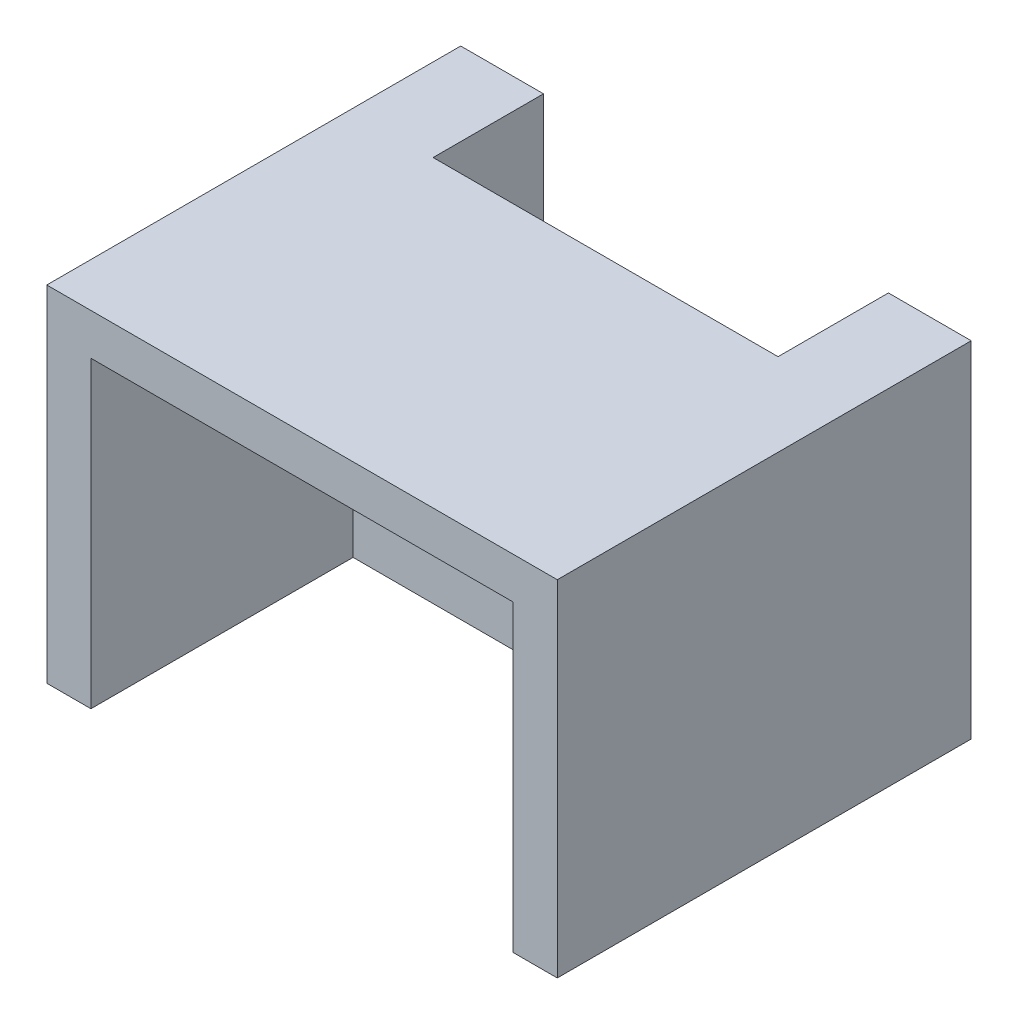
ISO-10303-21;
HEADER;
FILE_DESCRIPTION(('STEP AP214'),'2;1');
FILE_NAME('part.step','',(''),(''),'','','');
FILE_SCHEMA(('AUTOMOTIVE_DESIGN { 1 0 10303 214 1 1 1 1 }'));
ENDSEC;
DATA;
#1=APPLICATION_CONTEXT('core data for automotive mechanical design processes');
#2=APPLICATION_PROTOCOL_DEFINITION('international standard','automotive_design',2000,#1);
#3=PRODUCT_CONTEXT('',#1,'mechanical');
#4=PRODUCT('Part','Part','',(#3));
#5=PRODUCT_RELATED_PRODUCT_CATEGORY('part','',(#4));
#6=PRODUCT_DEFINITION_FORMATION('','',#4);
#7=PRODUCT_DEFINITION_CONTEXT('part definition',#1,'design');
#8=PRODUCT_DEFINITION('design','',#6,#7);
#9=PRODUCT_DEFINITION_SHAPE('','',#8);
#10=(LENGTH_UNIT() NAMED_UNIT(*) SI_UNIT(.MILLI.,.METRE.));
#11=(NAMED_UNIT(*) PLANE_ANGLE_UNIT() SI_UNIT($,.RADIAN.));
#12=(NAMED_UNIT(*) SI_UNIT($,.STERADIAN.) SOLID_ANGLE_UNIT());
#13=UNCERTAINTY_MEASURE_WITH_UNIT(LENGTH_MEASURE(1.E-05),#10,'distance_accuracy_value','');
#14=(GEOMETRIC_REPRESENTATION_CONTEXT(3) GLOBAL_UNCERTAINTY_ASSIGNED_CONTEXT((#13)) GLOBAL_UNIT_ASSIGNED_CONTEXT((#10,
#11,#12)) REPRESENTATION_CONTEXT('',''));
#15=CARTESIAN_POINT('',(0.,0.,0.));
#16=DIRECTION('',(0.,0.,1.));
#17=DIRECTION('',(1.,0.,0.));
#18=AXIS2_PLACEMENT_3D('',#15,#16,#17);
#19=CARTESIAN_POINT('',(0.,0.,-22.));
#20=DIRECTION('',(0.,0.,-1.));
#21=DIRECTION('',(0.,1.,0.));
#22=AXIS2_PLACEMENT_3D('',#19,#20,#21);
#23=PLANE('',#22);
#24=DIRECTION('',(0.,-1.,0.));
#25=VECTOR('',#24,1.);
#26=CARTESIAN_POINT('',(31.,0.,-22.));
#27=LINE('',#26,#25);
#28=CARTESIAN_POINT('',(31.,0.,-22.));
#29=VERTEX_POINT('',#28);
#30=CARTESIAN_POINT('',(31.,-15.,-22.));
#31=VERTEX_POINT('',#30);
#32=EDGE_CURVE('E222',#29,#31,#27,.T.);
#33=ORIENTED_EDGE('',*,*,#32,.T.);
#34=DIRECTION('',(1.,0.,0.));
#35=VECTOR('',#34,1.);
#36=CARTESIAN_POINT('',(30.2,-15.,-22.));
#37=LINE('',#36,#35);
#38=CARTESIAN_POINT('',(30.2,-15.,-22.));
#39=VERTEX_POINT('',#38);
#40=EDGE_CURVE('E215',#39,#31,#37,.T.);
#41=ORIENTED_EDGE('',*,*,#40,.F.);
#42=DIRECTION('',(0.,1.,0.));
#43=VECTOR('',#42,1.);
#44=CARTESIAN_POINT('',(30.2,-25.,-22.));
#45=LINE('',#44,#43);
#46=CARTESIAN_POINT('',(30.2,-25.,-22.));
#47=VERTEX_POINT('',#46);
#48=EDGE_CURVE('E202',#47,#39,#45,.T.);
#49=ORIENTED_EDGE('',*,*,#48,.F.);
#50=DIRECTION('',(-1.,0.,0.));
#51=VECTOR('',#50,1.);
#52=CARTESIAN_POINT('',(31.,-25.,-22.));
#53=LINE('',#52,#51);
#54=CARTESIAN_POINT('',(6.8,-25.,-22.));
#55=VERTEX_POINT('',#54);
#56=EDGE_CURVE('E213',#47,#55,#53,.T.);
#57=ORIENTED_EDGE('',*,*,#56,.T.);
#58=DIRECTION('',(0.,-1.,0.));
#59=VECTOR('',#58,1.);
#60=CARTESIAN_POINT('',(6.8,-15.,-22.));
#61=LINE('',#60,#59);
#62=CARTESIAN_POINT('',(6.8,-15.,-22.));
#63=VERTEX_POINT('',#62);
#64=EDGE_CURVE('E390',#63,#55,#61,.T.);
#65=ORIENTED_EDGE('',*,*,#64,.F.);
#66=DIRECTION('',(-1.,0.,0.));
#67=VECTOR('',#66,1.);
#68=CARTESIAN_POINT('',(6.8,-15.,-22.));
#69=LINE('',#68,#67);
#70=CARTESIAN_POINT('',(6.,-15.,-22.));
#71=VERTEX_POINT('',#70);
#72=EDGE_CURVE('E376',#63,#71,#69,.T.);
#73=ORIENTED_EDGE('',*,*,#72,.T.);
#74=DIRECTION('',(0.,1.,0.));
#75=VECTOR('',#74,1.);
#76=CARTESIAN_POINT('',(6.,0.,-22.));
#77=LINE('',#76,#75);
#78=CARTESIAN_POINT('',(6.,0.,-22.));
#79=VERTEX_POINT('',#78);
#80=EDGE_CURVE('E58',#71,#79,#77,.T.);
#81=ORIENTED_EDGE('',*,*,#80,.T.);
#82=DIRECTION('',(1.,0.,0.));
#83=VECTOR('',#82,1.);
#84=CARTESIAN_POINT('',(31.,0.,-22.));
#85=LINE('',#84,#83);
#86=EDGE_CURVE('E224',#79,#29,#85,.T.);
#87=ORIENTED_EDGE('',*,*,#86,.T.);
#88=EDGE_LOOP('',(#33,#41,#49,#57,#65,#73,#81,#87));
#89=FACE_BOUND('',#88,.T.);
#90=ADVANCED_FACE('F35',(#89),#23,.T.);
#91=CARTESIAN_POINT('',(31.,0.,-22.));
#92=DIRECTION('',(1.,0.,0.));
#93=DIRECTION('',(0.,1.,0.));
#94=AXIS2_PLACEMENT_3D('',#91,#92,#93);
#95=PLANE('',#94);
#96=DIRECTION('',(0.,0.,-1.));
#97=VECTOR('',#96,1.);
#98=CARTESIAN_POINT('',(31.,-15.,-22.));
#99=LINE('',#98,#97);
#100=CARTESIAN_POINT('',(31.,-15.,-26.5282800414558));
#101=VERTEX_POINT('',#100);
#102=EDGE_CURVE('E425',#31,#101,#99,.T.);
#103=ORIENTED_EDGE('',*,*,#102,.F.);
#104=ORIENTED_EDGE('',*,*,#32,.F.);
#105=DIRECTION('',(0.,0.,-1.));
#106=VECTOR('',#105,1.);
#107=CARTESIAN_POINT('',(31.,0.,-22.));
#108=LINE('',#107,#106);
#109=CARTESIAN_POINT('',(31.,0.,-30.));
#110=VERTEX_POINT('',#109);
#111=EDGE_CURVE('E232',#29,#110,#108,.T.);
#112=ORIENTED_EDGE('',*,*,#111,.T.);
#113=DIRECTION('',(0.,1.,0.));
#114=VECTOR('',#113,1.);
#115=CARTESIAN_POINT('',(31.,-25.,-30.));
#116=LINE('',#115,#114);
#117=CARTESIAN_POINT('',(31.,-15.,-30.));
#118=VERTEX_POINT('',#117);
#119=EDGE_CURVE('E347',#118,#110,#116,.T.);
#120=ORIENTED_EDGE('',*,*,#119,.F.);
#121=DIRECTION('',(0.,0.,-1.));
#122=VECTOR('',#121,1.);
#123=CARTESIAN_POINT('',(31.,-15.,-27.633974643175));
#124=LINE('',#123,#122);
#125=CARTESIAN_POINT('',(31.,-15.,-27.633974643175));
#126=VERTEX_POINT('',#125);
#127=EDGE_CURVE('E208',#126,#118,#124,.T.);
#128=ORIENTED_EDGE('',*,*,#127,.F.);
#129=DIRECTION('',(0.,0.994849751721338,0.101360601320199));
#130=VECTOR('',#129,1.);
#131=CARTESIAN_POINT('',(31.,-23.5,-28.5));
#132=LINE('',#131,#130);
#133=CARTESIAN_POINT('',(31.,-23.5,-28.5));
#134=VERTEX_POINT('',#133);
#135=EDGE_CURVE('E419',#134,#126,#132,.T.);
#136=ORIENTED_EDGE('',*,*,#135,.F.);
#137=DIRECTION('',(0.,0.,-1.));
#138=VECTOR('',#137,1.);
#139=CARTESIAN_POINT('',(31.,-23.5,-27.3943053982808));
#140=LINE('',#139,#138);
#141=CARTESIAN_POINT('',(31.,-23.5,-27.3943053982808));
#142=VERTEX_POINT('',#141);
#143=EDGE_CURVE('E421',#142,#134,#140,.T.);
#144=ORIENTED_EDGE('',*,*,#143,.F.);
#145=DIRECTION('',(0.,-0.994849751721338,-0.101360601320199));
#146=VECTOR('',#145,1.);
#147=CARTESIAN_POINT('',(31.,-15.,-26.5282800414558));
#148=LINE('',#147,#146);
#149=EDGE_CURVE('E423',#101,#142,#148,.T.);
#150=ORIENTED_EDGE('',*,*,#149,.F.);
#151=EDGE_LOOP('',(#103,#104,#112,#120,#128,#136,#144,#150));
#152=FACE_BOUND('',#151,.T.);
#153=ADVANCED_FACE('F300',(#152),#95,.F.);
#154=CARTESIAN_POINT('',(6.,0.,-22.));
#155=DIRECTION('',(-1.,0.,0.));
#156=DIRECTION('',(0.,-1.,0.));
#157=AXIS2_PLACEMENT_3D('',#154,#155,#156);
#158=PLANE('',#157);
#159=DIRECTION('',(0.,0.,1.));
#160=VECTOR('',#159,1.);
#161=CARTESIAN_POINT('',(6.,-15.,-30.));
#162=LINE('',#161,#160);
#163=CARTESIAN_POINT('',(6.,-15.,-30.));
#164=VERTEX_POINT('',#163);
#165=CARTESIAN_POINT('',(6.,-15.,-27.633974643175));
#166=VERTEX_POINT('',#165);
#167=EDGE_CURVE('E387',#164,#166,#162,.T.);
#168=ORIENTED_EDGE('',*,*,#167,.F.);
#169=DIRECTION('',(0.,-1.,0.));
#170=VECTOR('',#169,1.);
#171=CARTESIAN_POINT('',(6.,0.,-30.));
#172=LINE('',#171,#170);
#173=CARTESIAN_POINT('',(6.,0.,-30.));
#174=VERTEX_POINT('',#173);
#175=EDGE_CURVE('E352',#174,#164,#172,.T.);
#176=ORIENTED_EDGE('',*,*,#175,.F.);
#177=DIRECTION('',(0.,0.,-1.));
#178=VECTOR('',#177,1.);
#179=CARTESIAN_POINT('',(6.,0.,-22.));
#180=LINE('',#179,#178);
#181=EDGE_CURVE('E231',#79,#174,#180,.T.);
#182=ORIENTED_EDGE('',*,*,#181,.F.);
#183=ORIENTED_EDGE('',*,*,#80,.F.);
#184=DIRECTION('',(0.,0.,1.));
#185=VECTOR('',#184,1.);
#186=CARTESIAN_POINT('',(6.,-15.,-26.5282800414558));
#187=LINE('',#186,#185);
#188=CARTESIAN_POINT('',(6.,-15.,-26.5282800414558));
#189=VERTEX_POINT('',#188);
#190=EDGE_CURVE('E378',#189,#71,#187,.T.);
#191=ORIENTED_EDGE('',*,*,#190,.F.);
#192=DIRECTION('',(0.,0.994849751721338,0.101360601320199));
#193=VECTOR('',#192,1.);
#194=CARTESIAN_POINT('',(5.99999999999999,-23.5,-27.3943053982808));
#195=LINE('',#194,#193);
#196=CARTESIAN_POINT('',(5.99999999999999,-23.5,-27.3943053982808));
#197=VERTEX_POINT('',#196);
#198=EDGE_CURVE('E381',#197,#189,#195,.T.);
#199=ORIENTED_EDGE('',*,*,#198,.F.);
#200=DIRECTION('',(0.,0.,1.));
#201=VECTOR('',#200,1.);
#202=CARTESIAN_POINT('',(5.99999999999999,-23.5,-28.5));
#203=LINE('',#202,#201);
#204=CARTESIAN_POINT('',(5.99999999999999,-23.5,-28.5));
#205=VERTEX_POINT('',#204);
#206=EDGE_CURVE('E383',#205,#197,#203,.T.);
#207=ORIENTED_EDGE('',*,*,#206,.F.);
#208=DIRECTION('',(0.,-0.994849751721338,-0.101360601320199));
#209=VECTOR('',#208,1.);
#210=CARTESIAN_POINT('',(6.,-15.,-27.633974643175));
#211=LINE('',#210,#209);
#212=EDGE_CURVE('E385',#166,#205,#211,.T.);
#213=ORIENTED_EDGE('',*,*,#212,.F.);
#214=EDGE_LOOP('',(#168,#176,#182,#183,#191,#199,#207,#213));
#215=FACE_BOUND('',#214,.T.);
#216=ADVANCED_FACE('F294',(#215),#158,.F.);
#217=CARTESIAN_POINT('',(37.,-25.,0.));
#218=DIRECTION('',(0.,0.,-1.));
#219=DIRECTION('',(0.,1.,0.));
#220=AXIS2_PLACEMENT_3D('',#217,#218,#219);
#221=PLANE('',#220);
#222=DIRECTION('',(1.,0.,0.));
#223=VECTOR('',#222,1.);
#224=CARTESIAN_POINT('',(33.8,-3.,0.));
#225=LINE('',#224,#223);
#226=CARTESIAN_POINT('',(3.2,-3.,0.));
#227=VERTEX_POINT('',#226);
#228=CARTESIAN_POINT('',(33.8,-3.,0.));
#229=VERTEX_POINT('',#228);
#230=EDGE_CURVE('E242',#227,#229,#225,.T.);
#231=ORIENTED_EDGE('',*,*,#230,.T.);
#232=DIRECTION('',(0.,-1.,0.));
#233=VECTOR('',#232,1.);
#234=CARTESIAN_POINT('',(33.8,36.0188839360689,0.));
#235=LINE('',#234,#233);
#236=CARTESIAN_POINT('',(33.8,-25.,0.));
#237=VERTEX_POINT('',#236);
#238=EDGE_CURVE('E240',#229,#237,#235,.T.);
#239=ORIENTED_EDGE('',*,*,#238,.T.);
#240=DIRECTION('',(-1.,0.,0.));
#241=VECTOR('',#240,1.);
#242=CARTESIAN_POINT('',(37.,-25.,0.));
#243=LINE('',#242,#241);
#244=CARTESIAN_POINT('',(37.,-25.,0.));
#245=VERTEX_POINT('',#244);
#246=EDGE_CURVE('E12',#245,#237,#243,.T.);
#247=ORIENTED_EDGE('',*,*,#246,.F.);
#248=DIRECTION('',(0.,-1.,0.));
#249=VECTOR('',#248,1.);
#250=CARTESIAN_POINT('',(37.,-25.,0.));
#251=LINE('',#250,#249);
#252=CARTESIAN_POINT('',(37.,0.,0.));
#253=VERTEX_POINT('',#252);
#254=EDGE_CURVE('E263',#253,#245,#251,.T.);
#255=ORIENTED_EDGE('',*,*,#254,.F.);
#256=DIRECTION('',(-1.,0.,0.));
#257=VECTOR('',#256,1.);
#258=CARTESIAN_POINT('',(37.,0.,0.));
#259=LINE('',#258,#257);
#260=CARTESIAN_POINT('',(0.,0.,0.));
#261=VERTEX_POINT('',#260);
#262=EDGE_CURVE('E271',#253,#261,#259,.T.);
#263=ORIENTED_EDGE('',*,*,#262,.T.);
#264=DIRECTION('',(0.,-1.,0.));
#265=VECTOR('',#264,1.);
#266=CARTESIAN_POINT('',(0.,-25.,0.));
#267=LINE('',#266,#265);
#268=CARTESIAN_POINT('',(0.,-25.,0.));
#269=VERTEX_POINT('',#268);
#270=EDGE_CURVE('E262',#261,#269,#267,.T.);
#271=ORIENTED_EDGE('',*,*,#270,.T.);
#272=CARTESIAN_POINT('',(3.2,-25.,0.));
#273=VERTEX_POINT('',#272);
#274=EDGE_CURVE('E43',#273,#269,#243,.T.);
#275=ORIENTED_EDGE('',*,*,#274,.F.);
#276=DIRECTION('',(0.,-1.,0.));
#277=VECTOR('',#276,1.);
#278=CARTESIAN_POINT('',(3.2,36.0188839360689,0.));
#279=LINE('',#278,#277);
#280=EDGE_CURVE('E253',#227,#273,#279,.T.);
#281=ORIENTED_EDGE('',*,*,#280,.F.);
#282=EDGE_LOOP('',(#231,#239,#247,#255,#263,#271,#275,#281));
#283=FACE_BOUND('',#282,.T.);
#284=ADVANCED_FACE('F37',(#283),#221,.F.);
#285=CARTESIAN_POINT('',(37.,-25.,-25.));
#286=DIRECTION('',(0.,1.,0.));
#287=DIRECTION('',(0.,0.,1.));
#288=AXIS2_PLACEMENT_3D('',#285,#286,#287);
#289=PLANE('',#288);
#290=ORIENTED_EDGE('',*,*,#56,.F.);
#291=DIRECTION('',(0.,0.,1.));
#292=VECTOR('',#291,1.);
#293=CARTESIAN_POINT('',(30.2,-25.,-30.));
#294=LINE('',#293,#292);
#295=CARTESIAN_POINT('',(30.2,-25.,-30.));
#296=VERTEX_POINT('',#295);
#297=EDGE_CURVE('E199',#296,#47,#294,.T.);
#298=ORIENTED_EDGE('',*,*,#297,.F.);
#299=DIRECTION('',(-1.,0.,0.));
#300=VECTOR('',#299,1.);
#301=CARTESIAN_POINT('',(37.,-25.,-30.));
#302=LINE('',#301,#300);
#303=CARTESIAN_POINT('',(37.,-25.,-30.));
#304=VERTEX_POINT('',#303);
#305=EDGE_CURVE('E348',#304,#296,#302,.T.);
#306=ORIENTED_EDGE('',*,*,#305,.F.);
#307=DIRECTION('',(0.,0.,-1.));
#308=VECTOR('',#307,1.);
#309=CARTESIAN_POINT('',(37.,-25.,-25.));
#310=LINE('',#309,#308);
#311=EDGE_CURVE('E266',#245,#304,#310,.T.);
#312=ORIENTED_EDGE('',*,*,#311,.F.);
#313=ORIENTED_EDGE('',*,*,#246,.T.);
#314=DIRECTION('',(0.,0.,1.));
#315=VECTOR('',#314,1.);
#316=CARTESIAN_POINT('',(33.8,-25.,-19.));
#317=LINE('',#316,#315);
#318=CARTESIAN_POINT('',(33.8,-25.,-19.));
#319=VERTEX_POINT('',#318);
#320=EDGE_CURVE('E251',#319,#237,#317,.T.);
#321=ORIENTED_EDGE('',*,*,#320,.F.);
#322=DIRECTION('',(1.,0.,0.));
#323=VECTOR('',#322,1.);
#324=CARTESIAN_POINT('',(3.2,-25.,-19.));
#325=LINE('',#324,#323);
#326=CARTESIAN_POINT('',(3.2,-25.,-19.));
#327=VERTEX_POINT('',#326);
#328=EDGE_CURVE('E248',#327,#319,#325,.T.);
#329=ORIENTED_EDGE('',*,*,#328,.F.);
#330=DIRECTION('',(0.,0.,-1.));
#331=VECTOR('',#330,1.);
#332=CARTESIAN_POINT('',(3.2,-25.,0.));
#333=LINE('',#332,#331);
#334=EDGE_CURVE('E235',#273,#327,#333,.T.);
#335=ORIENTED_EDGE('',*,*,#334,.F.);
#336=ORIENTED_EDGE('',*,*,#274,.T.);
#337=DIRECTION('',(0.,0.,-1.));
#338=VECTOR('',#337,1.);
#339=CARTESIAN_POINT('',(0.,-25.,-25.));
#340=LINE('',#339,#338);
#341=CARTESIAN_POINT('',(0.,-25.,-30.));
#342=VERTEX_POINT('',#341);
#343=EDGE_CURVE('E274',#269,#342,#340,.T.);
#344=ORIENTED_EDGE('',*,*,#343,.T.);
#345=DIRECTION('',(-1.,0.,0.));
#346=VECTOR('',#345,1.);
#347=CARTESIAN_POINT('',(5.99999999999999,-25.,-30.));
#348=LINE('',#347,#346);
#349=CARTESIAN_POINT('',(6.8,-25.,-30.));
#350=VERTEX_POINT('',#349);
#351=EDGE_CURVE('E349',#350,#342,#348,.T.);
#352=ORIENTED_EDGE('',*,*,#351,.F.);
#353=DIRECTION('',(0.,0.,-1.));
#354=VECTOR('',#353,1.);
#355=CARTESIAN_POINT('',(6.8,-25.,-22.));
#356=LINE('',#355,#354);
#357=EDGE_CURVE('E221',#55,#350,#356,.T.);
#358=ORIENTED_EDGE('',*,*,#357,.F.);
#359=EDGE_LOOP('',(#290,#298,#306,#312,#313,#321,#329,#335,#336,#344,#352,#358));
#360=FACE_BOUND('',#359,.T.);
#361=ADVANCED_FACE('F219',(#360),#289,.F.);
#362=CARTESIAN_POINT('',(37.,0.,0.));
#363=DIRECTION('',(0.,-1.,0.));
#364=DIRECTION('',(0.,0.,-1.));
#365=AXIS2_PLACEMENT_3D('',#362,#363,#364);
#366=PLANE('',#365);
#367=DIRECTION('',(0.,0.,1.));
#368=VECTOR('',#367,1.);
#369=CARTESIAN_POINT('',(37.,0.,0.));
#370=LINE('',#369,#368);
#371=CARTESIAN_POINT('',(37.,0.,-30.));
#372=VERTEX_POINT('',#371);
#373=EDGE_CURVE('E269',#372,#253,#370,.T.);
#374=ORIENTED_EDGE('',*,*,#373,.F.);
#375=DIRECTION('',(1.,0.,0.));
#376=VECTOR('',#375,1.);
#377=CARTESIAN_POINT('',(31.,0.,-30.));
#378=LINE('',#377,#376);
#379=EDGE_CURVE('E226',#110,#372,#378,.T.);
#380=ORIENTED_EDGE('',*,*,#379,.F.);
#381=ORIENTED_EDGE('',*,*,#111,.F.);
#382=ORIENTED_EDGE('',*,*,#86,.F.);
#383=ORIENTED_EDGE('',*,*,#181,.T.);
#384=DIRECTION('',(1.,0.,0.));
#385=VECTOR('',#384,1.);
#386=CARTESIAN_POINT('',(0.,0.,-30.));
#387=LINE('',#386,#385);
#388=CARTESIAN_POINT('',(0.,0.,-30.));
#389=VERTEX_POINT('',#388);
#390=EDGE_CURVE('E358',#389,#174,#387,.T.);
#391=ORIENTED_EDGE('',*,*,#390,.F.);
#392=DIRECTION('',(0.,0.,1.));
#393=VECTOR('',#392,1.);
#394=CARTESIAN_POINT('',(0.,0.,0.));
#395=LINE('',#394,#393);
#396=EDGE_CURVE('E267',#389,#261,#395,.T.);
#397=ORIENTED_EDGE('',*,*,#396,.T.);
#398=ORIENTED_EDGE('',*,*,#262,.F.);
#399=EDGE_LOOP('',(#374,#380,#381,#382,#383,#391,#397,#398));
#400=FACE_BOUND('',#399,.T.);
#401=ADVANCED_FACE('F299',(#400),#366,.F.);
#402=CARTESIAN_POINT('',(37.,0.,0.));
#403=DIRECTION('',(-1.,0.,0.));
#404=DIRECTION('',(0.,0.,1.));
#405=AXIS2_PLACEMENT_3D('',#402,#403,#404);
#406=PLANE('',#405);
#407=ORIENTED_EDGE('',*,*,#254,.T.);
#408=ORIENTED_EDGE('',*,*,#311,.T.);
#409=DIRECTION('',(0.,-1.,0.));
#410=VECTOR('',#409,1.);
#411=CARTESIAN_POINT('',(37.,0.,-30.));
#412=LINE('',#411,#410);
#413=EDGE_CURVE('E345',#372,#304,#412,.T.);
#414=ORIENTED_EDGE('',*,*,#413,.F.);
#415=ORIENTED_EDGE('',*,*,#373,.T.);
#416=EDGE_LOOP('',(#407,#408,#414,#415));
#417=FACE_BOUND('',#416,.T.);
#418=ADVANCED_FACE('F330',(#417),#406,.F.);
#419=CARTESIAN_POINT('',(0.,0.,0.));
#420=DIRECTION('',(-1.,0.,0.));
#421=DIRECTION('',(0.,0.,1.));
#422=AXIS2_PLACEMENT_3D('',#419,#420,#421);
#423=PLANE('',#422);
#424=ORIENTED_EDGE('',*,*,#270,.F.);
#425=ORIENTED_EDGE('',*,*,#396,.F.);
#426=DIRECTION('',(0.,1.,0.));
#427=VECTOR('',#426,1.);
#428=CARTESIAN_POINT('',(0.,-25.,-30.));
#429=LINE('',#428,#427);
#430=EDGE_CURVE('E291',#342,#389,#429,.T.);
#431=ORIENTED_EDGE('',*,*,#430,.F.);
#432=ORIENTED_EDGE('',*,*,#343,.F.);
#433=EDGE_LOOP('',(#424,#425,#431,#432));
#434=FACE_BOUND('',#433,.T.);
#435=ADVANCED_FACE('F289',(#434),#423,.T.);
#436=CARTESIAN_POINT('',(33.8,36.0188839360689,-19.));
#437=DIRECTION('',(1.,0.,0.));
#438=DIRECTION('',(0.,0.,-1.));
#439=AXIS2_PLACEMENT_3D('',#436,#437,#438);
#440=PLANE('',#439);
#441=DIRECTION('',(0.,0.,-1.));
#442=VECTOR('',#441,1.);
#443=CARTESIAN_POINT('',(33.8,-3.,-19.));
#444=LINE('',#443,#442);
#445=CARTESIAN_POINT('',(33.8,-3.,-19.));
#446=VERTEX_POINT('',#445);
#447=EDGE_CURVE('E239',#229,#446,#444,.T.);
#448=ORIENTED_EDGE('',*,*,#447,.T.);
#449=DIRECTION('',(0.,-1.,0.));
#450=VECTOR('',#449,1.);
#451=CARTESIAN_POINT('',(33.8,36.0188839360689,-19.));
#452=LINE('',#451,#450);
#453=EDGE_CURVE('E256',#446,#319,#452,.T.);
#454=ORIENTED_EDGE('',*,*,#453,.T.);
#455=ORIENTED_EDGE('',*,*,#320,.T.);
#456=ORIENTED_EDGE('',*,*,#238,.F.);
#457=EDGE_LOOP('',(#448,#454,#455,#456));
#458=FACE_BOUND('',#457,.T.);
#459=ADVANCED_FACE('F319',(#458),#440,.F.);
#460=CARTESIAN_POINT('',(3.2,36.0188839360689,-19.));
#461=DIRECTION('',(0.,0.,-1.));
#462=DIRECTION('',(0.,1.,0.));
#463=AXIS2_PLACEMENT_3D('',#460,#461,#462);
#464=PLANE('',#463);
#465=DIRECTION('',(-1.,0.,0.));
#466=VECTOR('',#465,1.);
#467=CARTESIAN_POINT('',(3.2,-3.,-19.));
#468=LINE('',#467,#466);
#469=CARTESIAN_POINT('',(3.2,-2.99999999999999,-19.));
#470=VERTEX_POINT('',#469);
#471=EDGE_CURVE('E237',#446,#470,#468,.T.);
#472=ORIENTED_EDGE('',*,*,#471,.T.);
#473=DIRECTION('',(0.,-1.,0.));
#474=VECTOR('',#473,1.);
#475=CARTESIAN_POINT('',(3.2,36.0188839360689,-19.));
#476=LINE('',#475,#474);
#477=EDGE_CURVE('E258',#470,#327,#476,.T.);
#478=ORIENTED_EDGE('',*,*,#477,.T.);
#479=ORIENTED_EDGE('',*,*,#328,.T.);
#480=ORIENTED_EDGE('',*,*,#453,.F.);
#481=EDGE_LOOP('',(#472,#478,#479,#480));
#482=FACE_BOUND('',#481,.T.);
#483=ADVANCED_FACE('F322',(#482),#464,.F.);
#484=CARTESIAN_POINT('',(3.2,36.0188839360689,0.));
#485=DIRECTION('',(-1.,0.,0.));
#486=DIRECTION('',(0.,0.,1.));
#487=AXIS2_PLACEMENT_3D('',#484,#485,#486);
#488=PLANE('',#487);
#489=DIRECTION('',(0.,0.,1.));
#490=VECTOR('',#489,1.);
#491=CARTESIAN_POINT('',(3.2,-3.,0.));
#492=LINE('',#491,#490);
#493=EDGE_CURVE('E245',#470,#227,#492,.T.);
#494=ORIENTED_EDGE('',*,*,#493,.T.);
#495=ORIENTED_EDGE('',*,*,#280,.T.);
#496=ORIENTED_EDGE('',*,*,#334,.T.);
#497=ORIENTED_EDGE('',*,*,#477,.F.);
#498=EDGE_LOOP('',(#494,#495,#496,#497));
#499=FACE_BOUND('',#498,.T.);
#500=ADVANCED_FACE('F317',(#499),#488,.F.);
#501=CARTESIAN_POINT('',(37.,-3.,0.));
#502=DIRECTION('',(0.,-1.,0.));
#503=DIRECTION('',(0.,0.,-1.));
#504=AXIS2_PLACEMENT_3D('',#501,#502,#503);
#505=PLANE('',#504);
#506=ORIENTED_EDGE('',*,*,#230,.F.);
#507=ORIENTED_EDGE('',*,*,#493,.F.);
#508=ORIENTED_EDGE('',*,*,#471,.F.);
#509=ORIENTED_EDGE('',*,*,#447,.F.);
#510=EDGE_LOOP('',(#506,#507,#508,#509));
#511=FACE_BOUND('',#510,.T.);
#512=ADVANCED_FACE('F314',(#511),#505,.T.);
#513=CARTESIAN_POINT('',(0.,0.,-30.));
#514=DIRECTION('',(0.,0.,-1.));
#515=DIRECTION('',(0.,1.,0.));
#516=AXIS2_PLACEMENT_3D('',#513,#514,#515);
#517=PLANE('',#516);
#518=ORIENTED_EDGE('',*,*,#413,.T.);
#519=ORIENTED_EDGE('',*,*,#305,.T.);
#520=DIRECTION('',(0.,-1.,0.));
#521=VECTOR('',#520,1.);
#522=CARTESIAN_POINT('',(30.2,-15.,-30.));
#523=LINE('',#522,#521);
#524=CARTESIAN_POINT('',(30.2,-15.,-30.));
#525=VERTEX_POINT('',#524);
#526=EDGE_CURVE('E204',#525,#296,#523,.T.);
#527=ORIENTED_EDGE('',*,*,#526,.F.);
#528=DIRECTION('',(1.,0.,0.));
#529=VECTOR('',#528,1.);
#530=CARTESIAN_POINT('',(30.2,-15.,-30.));
#531=LINE('',#530,#529);
#532=EDGE_CURVE('E50',#525,#118,#531,.T.);
#533=ORIENTED_EDGE('',*,*,#532,.T.);
#534=ORIENTED_EDGE('',*,*,#119,.T.);
#535=ORIENTED_EDGE('',*,*,#379,.T.);
#536=EDGE_LOOP('',(#518,#519,#527,#533,#534,#535));
#537=FACE_BOUND('',#536,.T.);
#538=ADVANCED_FACE('F311',(#537),#517,.T.);
#539=CARTESIAN_POINT('',(0.,0.,-30.));
#540=DIRECTION('',(0.,0.,-1.));
#541=DIRECTION('',(0.,1.,0.));
#542=AXIS2_PLACEMENT_3D('',#539,#540,#541);
#543=PLANE('',#542);
#544=ORIENTED_EDGE('',*,*,#430,.T.);
#545=ORIENTED_EDGE('',*,*,#390,.T.);
#546=ORIENTED_EDGE('',*,*,#175,.T.);
#547=DIRECTION('',(-1.,0.,0.));
#548=VECTOR('',#547,1.);
#549=CARTESIAN_POINT('',(6.8,-15.,-30.));
#550=LINE('',#549,#548);
#551=CARTESIAN_POINT('',(6.8,-15.,-30.));
#552=VERTEX_POINT('',#551);
#553=EDGE_CURVE('E362',#552,#164,#550,.T.);
#554=ORIENTED_EDGE('',*,*,#553,.F.);
#555=DIRECTION('',(0.,1.,0.));
#556=VECTOR('',#555,1.);
#557=CARTESIAN_POINT('',(6.8,-25.,-30.));
#558=LINE('',#557,#556);
#559=EDGE_CURVE('E380',#350,#552,#558,.T.);
#560=ORIENTED_EDGE('',*,*,#559,.F.);
#561=ORIENTED_EDGE('',*,*,#351,.T.);
#562=EDGE_LOOP('',(#544,#545,#546,#554,#560,#561));
#563=FACE_BOUND('',#562,.T.);
#564=ADVANCED_FACE('F470',(#563),#543,.T.);
#565=CARTESIAN_POINT('',(6.8,-15.,-30.));
#566=DIRECTION('',(0.,-1.,0.));
#567=DIRECTION('',(1.,0.,0.));
#568=AXIS2_PLACEMENT_3D('',#565,#566,#567);
#569=PLANE('',#568);
#570=ORIENTED_EDGE('',*,*,#167,.T.);
#571=DIRECTION('',(-1.,0.,0.));
#572=VECTOR('',#571,1.);
#573=CARTESIAN_POINT('',(6.8,-15.,-27.633974643175));
#574=LINE('',#573,#572);
#575=CARTESIAN_POINT('',(6.8,-15.,-27.633974643175));
#576=VERTEX_POINT('',#575);
#577=EDGE_CURVE('E364',#576,#166,#574,.T.);
#578=ORIENTED_EDGE('',*,*,#577,.F.);
#579=DIRECTION('',(0.,0.,1.));
#580=VECTOR('',#579,1.);
#581=CARTESIAN_POINT('',(6.8,-15.,-30.));
#582=LINE('',#581,#580);
#583=EDGE_CURVE('E400',#552,#576,#582,.T.);
#584=ORIENTED_EDGE('',*,*,#583,.F.);
#585=ORIENTED_EDGE('',*,*,#553,.T.);
#586=EDGE_LOOP('',(#570,#578,#584,#585));
#587=FACE_BOUND('',#586,.T.);
#588=ADVANCED_FACE('F477',(#587),#569,.F.);
#589=CARTESIAN_POINT('',(6.8,-15.,-27.633974643175));
#590=DIRECTION('',(0.,0.101360601320199,-0.994849751721338));
#591=DIRECTION('',(0.,0.994849751721338,0.101360601320199));
#592=AXIS2_PLACEMENT_3D('',#589,#590,#591);
#593=PLANE('',#592);
#594=ORIENTED_EDGE('',*,*,#212,.T.);
#595=DIRECTION('',(-1.,0.,0.));
#596=VECTOR('',#595,1.);
#597=CARTESIAN_POINT('',(6.8,-23.5,-28.5));
#598=LINE('',#597,#596);
#599=CARTESIAN_POINT('',(6.8,-23.5,-28.5));
#600=VERTEX_POINT('',#599);
#601=EDGE_CURVE('E367',#600,#205,#598,.T.);
#602=ORIENTED_EDGE('',*,*,#601,.F.);
#603=DIRECTION('',(0.,-0.994849751721338,-0.101360601320199));
#604=VECTOR('',#603,1.);
#605=CARTESIAN_POINT('',(6.8,-15.,-27.633974643175));
#606=LINE('',#605,#604);
#607=EDGE_CURVE('E398',#576,#600,#606,.T.);
#608=ORIENTED_EDGE('',*,*,#607,.F.);
#609=ORIENTED_EDGE('',*,*,#577,.T.);
#610=EDGE_LOOP('',(#594,#602,#608,#609));
#611=FACE_BOUND('',#610,.T.);
#612=ADVANCED_FACE('F480',(#611),#593,.F.);
#613=CARTESIAN_POINT('',(6.8,-23.5,-28.5));
#614=DIRECTION('',(0.,-1.,0.));
#615=DIRECTION('',(0.,0.,-1.));
#616=AXIS2_PLACEMENT_3D('',#613,#614,#615);
#617=PLANE('',#616);
#618=ORIENTED_EDGE('',*,*,#206,.T.);
#619=DIRECTION('',(-1.,0.,0.));
#620=VECTOR('',#619,1.);
#621=CARTESIAN_POINT('',(6.8,-23.5,-27.3943053982808));
#622=LINE('',#621,#620);
#623=CARTESIAN_POINT('',(6.8,-23.5,-27.3943053982808));
#624=VERTEX_POINT('',#623);
#625=EDGE_CURVE('E370',#624,#197,#622,.T.);
#626=ORIENTED_EDGE('',*,*,#625,.F.);
#627=DIRECTION('',(0.,0.,1.));
#628=VECTOR('',#627,1.);
#629=CARTESIAN_POINT('',(6.8,-23.5,-28.5));
#630=LINE('',#629,#628);
#631=EDGE_CURVE('E396',#600,#624,#630,.T.);
#632=ORIENTED_EDGE('',*,*,#631,.F.);
#633=ORIENTED_EDGE('',*,*,#601,.T.);
#634=EDGE_LOOP('',(#618,#626,#632,#633));
#635=FACE_BOUND('',#634,.T.);
#636=ADVANCED_FACE('F498',(#635),#617,.F.);
#637=CARTESIAN_POINT('',(6.8,-23.5,-27.3943053982808));
#638=DIRECTION('',(0.,-0.101360601320199,0.994849751721338));
#639=DIRECTION('',(0.,-0.994849751721338,-0.101360601320199));
#640=AXIS2_PLACEMENT_3D('',#637,#638,#639);
#641=PLANE('',#640);
#642=ORIENTED_EDGE('',*,*,#198,.T.);
#643=DIRECTION('',(-1.,0.,0.));
#644=VECTOR('',#643,1.);
#645=CARTESIAN_POINT('',(6.8,-15.,-26.5282800414558));
#646=LINE('',#645,#644);
#647=CARTESIAN_POINT('',(6.8,-15.,-26.5282800414558));
#648=VERTEX_POINT('',#647);
#649=EDGE_CURVE('E373',#648,#189,#646,.T.);
#650=ORIENTED_EDGE('',*,*,#649,.F.);
#651=DIRECTION('',(0.,0.994849751721338,0.101360601320199));
#652=VECTOR('',#651,1.);
#653=CARTESIAN_POINT('',(6.8,-23.5,-27.3943053982808));
#654=LINE('',#653,#652);
#655=EDGE_CURVE('E394',#624,#648,#654,.T.);
#656=ORIENTED_EDGE('',*,*,#655,.F.);
#657=ORIENTED_EDGE('',*,*,#625,.T.);
#658=EDGE_LOOP('',(#642,#650,#656,#657));
#659=FACE_BOUND('',#658,.T.);
#660=ADVANCED_FACE('F496',(#659),#641,.F.);
#661=CARTESIAN_POINT('',(6.8,-15.,-26.5282800414558));
#662=DIRECTION('',(0.,-1.,0.));
#663=DIRECTION('',(1.,0.,0.));
#664=AXIS2_PLACEMENT_3D('',#661,#662,#663);
#665=PLANE('',#664);
#666=ORIENTED_EDGE('',*,*,#190,.T.);
#667=ORIENTED_EDGE('',*,*,#72,.F.);
#668=DIRECTION('',(0.,0.,1.));
#669=VECTOR('',#668,1.);
#670=CARTESIAN_POINT('',(6.8,-15.,-26.5282800414558));
#671=LINE('',#670,#669);
#672=EDGE_CURVE('E392',#648,#63,#671,.T.);
#673=ORIENTED_EDGE('',*,*,#672,.F.);
#674=ORIENTED_EDGE('',*,*,#649,.T.);
#675=EDGE_LOOP('',(#666,#667,#673,#674));
#676=FACE_BOUND('',#675,.T.);
#677=ADVANCED_FACE('F492',(#676),#665,.F.);
#678=CARTESIAN_POINT('',(6.8,0.,0.));
#679=DIRECTION('',(1.,0.,0.));
#680=DIRECTION('',(0.,1.,0.));
#681=AXIS2_PLACEMENT_3D('',#678,#679,#680);
#682=PLANE('',#681);
#683=ORIENTED_EDGE('',*,*,#559,.T.);
#684=ORIENTED_EDGE('',*,*,#583,.T.);
#685=ORIENTED_EDGE('',*,*,#607,.T.);
#686=ORIENTED_EDGE('',*,*,#631,.T.);
#687=ORIENTED_EDGE('',*,*,#655,.T.);
#688=ORIENTED_EDGE('',*,*,#672,.T.);
#689=ORIENTED_EDGE('',*,*,#64,.T.);
#690=ORIENTED_EDGE('',*,*,#357,.T.);
#691=EDGE_LOOP('',(#683,#684,#685,#686,#687,#688,#689,#690));
#692=FACE_BOUND('',#691,.T.);
#693=ADVANCED_FACE('F484',(#692),#682,.T.);
#694=CARTESIAN_POINT('',(30.2,-15.,-22.));
#695=DIRECTION('',(0.,-1.,0.));
#696=DIRECTION('',(1.,0.,0.));
#697=AXIS2_PLACEMENT_3D('',#694,#695,#696);
#698=PLANE('',#697);
#699=ORIENTED_EDGE('',*,*,#102,.T.);
#700=DIRECTION('',(1.,0.,0.));
#701=VECTOR('',#700,1.);
#702=CARTESIAN_POINT('',(30.2,-15.,-26.5282800414558));
#703=LINE('',#702,#701);
#704=CARTESIAN_POINT('',(30.2,-15.,-26.5282800414558));
#705=VERTEX_POINT('',#704);
#706=EDGE_CURVE('E405',#705,#101,#703,.T.);
#707=ORIENTED_EDGE('',*,*,#706,.F.);
#708=DIRECTION('',(0.,0.,-1.));
#709=VECTOR('',#708,1.);
#710=CARTESIAN_POINT('',(30.2,-15.,-22.));
#711=LINE('',#710,#709);
#712=EDGE_CURVE('E216',#39,#705,#711,.T.);
#713=ORIENTED_EDGE('',*,*,#712,.F.);
#714=ORIENTED_EDGE('',*,*,#40,.T.);
#715=EDGE_LOOP('',(#699,#707,#713,#714));
#716=FACE_BOUND('',#715,.T.);
#717=ADVANCED_FACE('F440',(#716),#698,.F.);
#718=CARTESIAN_POINT('',(30.2,-15.,-26.5282800414558));
#719=DIRECTION('',(0.,-0.101360601320199,0.994849751721338));
#720=DIRECTION('',(0.,-0.994849751721338,-0.101360601320199));
#721=AXIS2_PLACEMENT_3D('',#718,#719,#720);
#722=PLANE('',#721);
#723=ORIENTED_EDGE('',*,*,#149,.T.);
#724=DIRECTION('',(1.,0.,0.));
#725=VECTOR('',#724,1.);
#726=CARTESIAN_POINT('',(30.2,-23.5,-27.3943053982808));
#727=LINE('',#726,#725);
#728=CARTESIAN_POINT('',(30.2,-23.5,-27.3943053982808));
#729=VERTEX_POINT('',#728);
#730=EDGE_CURVE('E408',#729,#142,#727,.T.);
#731=ORIENTED_EDGE('',*,*,#730,.F.);
#732=DIRECTION('',(0.,-0.994849751721338,-0.101360601320199));
#733=VECTOR('',#732,1.);
#734=CARTESIAN_POINT('',(30.2,-15.,-26.5282800414558));
#735=LINE('',#734,#733);
#736=EDGE_CURVE('E434',#705,#729,#735,.T.);
#737=ORIENTED_EDGE('',*,*,#736,.F.);
#738=ORIENTED_EDGE('',*,*,#706,.T.);
#739=EDGE_LOOP('',(#723,#731,#737,#738));
#740=FACE_BOUND('',#739,.T.);
#741=ADVANCED_FACE('F444',(#740),#722,.F.);
#742=CARTESIAN_POINT('',(30.2,-23.5,-27.3943053982808));
#743=DIRECTION('',(0.,-1.,0.));
#744=DIRECTION('',(0.,0.,-1.));
#745=AXIS2_PLACEMENT_3D('',#742,#743,#744);
#746=PLANE('',#745);
#747=ORIENTED_EDGE('',*,*,#143,.T.);
#748=DIRECTION('',(1.,0.,0.));
#749=VECTOR('',#748,1.);
#750=CARTESIAN_POINT('',(30.2,-23.5,-28.5));
#751=LINE('',#750,#749);
#752=CARTESIAN_POINT('',(30.2,-23.5,-28.5));
#753=VERTEX_POINT('',#752);
#754=EDGE_CURVE('E411',#753,#134,#751,.T.);
#755=ORIENTED_EDGE('',*,*,#754,.F.);
#756=DIRECTION('',(0.,0.,-1.));
#757=VECTOR('',#756,1.);
#758=CARTESIAN_POINT('',(30.2,-23.5,-27.3943053982808));
#759=LINE('',#758,#757);
#760=EDGE_CURVE('E432',#729,#753,#759,.T.);
#761=ORIENTED_EDGE('',*,*,#760,.F.);
#762=ORIENTED_EDGE('',*,*,#730,.T.);
#763=EDGE_LOOP('',(#747,#755,#761,#762));
#764=FACE_BOUND('',#763,.T.);
#765=ADVANCED_FACE('F449',(#764),#746,.F.);
#766=CARTESIAN_POINT('',(30.2,-23.5,-28.5));
#767=DIRECTION('',(0.,0.101360601320199,-0.994849751721338));
#768=DIRECTION('',(0.,0.994849751721338,0.101360601320199));
#769=AXIS2_PLACEMENT_3D('',#766,#767,#768);
#770=PLANE('',#769);
#771=ORIENTED_EDGE('',*,*,#135,.T.);
#772=DIRECTION('',(1.,0.,0.));
#773=VECTOR('',#772,1.);
#774=CARTESIAN_POINT('',(30.2,-15.,-27.633974643175));
#775=LINE('',#774,#773);
#776=CARTESIAN_POINT('',(30.2,-15.,-27.633974643175));
#777=VERTEX_POINT('',#776);
#778=EDGE_CURVE('E414',#777,#126,#775,.T.);
#779=ORIENTED_EDGE('',*,*,#778,.F.);
#780=DIRECTION('',(0.,0.994849751721338,0.101360601320199));
#781=VECTOR('',#780,1.);
#782=CARTESIAN_POINT('',(30.2,-23.5,-28.5));
#783=LINE('',#782,#781);
#784=EDGE_CURVE('E430',#753,#777,#783,.T.);
#785=ORIENTED_EDGE('',*,*,#784,.F.);
#786=ORIENTED_EDGE('',*,*,#754,.T.);
#787=EDGE_LOOP('',(#771,#779,#785,#786));
#788=FACE_BOUND('',#787,.T.);
#789=ADVANCED_FACE('F454',(#788),#770,.F.);
#790=CARTESIAN_POINT('',(30.2,-15.,-27.633974643175));
#791=DIRECTION('',(0.,-1.,0.));
#792=DIRECTION('',(1.,0.,0.));
#793=AXIS2_PLACEMENT_3D('',#790,#791,#792);
#794=PLANE('',#793);
#795=ORIENTED_EDGE('',*,*,#127,.T.);
#796=ORIENTED_EDGE('',*,*,#532,.F.);
#797=DIRECTION('',(0.,0.,-1.));
#798=VECTOR('',#797,1.);
#799=CARTESIAN_POINT('',(30.2,-15.,-27.633974643175));
#800=LINE('',#799,#798);
#801=EDGE_CURVE('E428',#777,#525,#800,.T.);
#802=ORIENTED_EDGE('',*,*,#801,.F.);
#803=ORIENTED_EDGE('',*,*,#778,.T.);
#804=EDGE_LOOP('',(#795,#796,#802,#803));
#805=FACE_BOUND('',#804,.T.);
#806=ADVANCED_FACE('F458',(#805),#794,.F.);
#807=CARTESIAN_POINT('',(30.2,0.,0.));
#808=DIRECTION('',(-1.,0.,0.));
#809=DIRECTION('',(0.,0.,1.));
#810=AXIS2_PLACEMENT_3D('',#807,#808,#809);
#811=PLANE('',#810);
#812=ORIENTED_EDGE('',*,*,#297,.T.);
#813=ORIENTED_EDGE('',*,*,#48,.T.);
#814=ORIENTED_EDGE('',*,*,#712,.T.);
#815=ORIENTED_EDGE('',*,*,#736,.T.);
#816=ORIENTED_EDGE('',*,*,#760,.T.);
#817=ORIENTED_EDGE('',*,*,#784,.T.);
#818=ORIENTED_EDGE('',*,*,#801,.T.);
#819=ORIENTED_EDGE('',*,*,#526,.T.);
#820=EDGE_LOOP('',(#812,#813,#814,#815,#816,#817,#818,#819));
#821=FACE_BOUND('',#820,.T.);
#822=ADVANCED_FACE('F201',(#821),#811,.T.);
#823=CLOSED_SHELL('',(#90,#153,#216,#284,#361,#401,#418,#435,#459,#483,#500,#512,#538,#564,#588,
#612,#636,#660,#677,#693,#717,#741,#765,#789,#806,#822));
#824=MANIFOLD_SOLID_BREP('B2',#823);
#825=ADVANCED_BREP_SHAPE_REPRESENTATION('',(#18,#824),#14);
#826=SHAPE_DEFINITION_REPRESENTATION(#9,#825);
ENDSEC;
END-ISO-10303-21;
